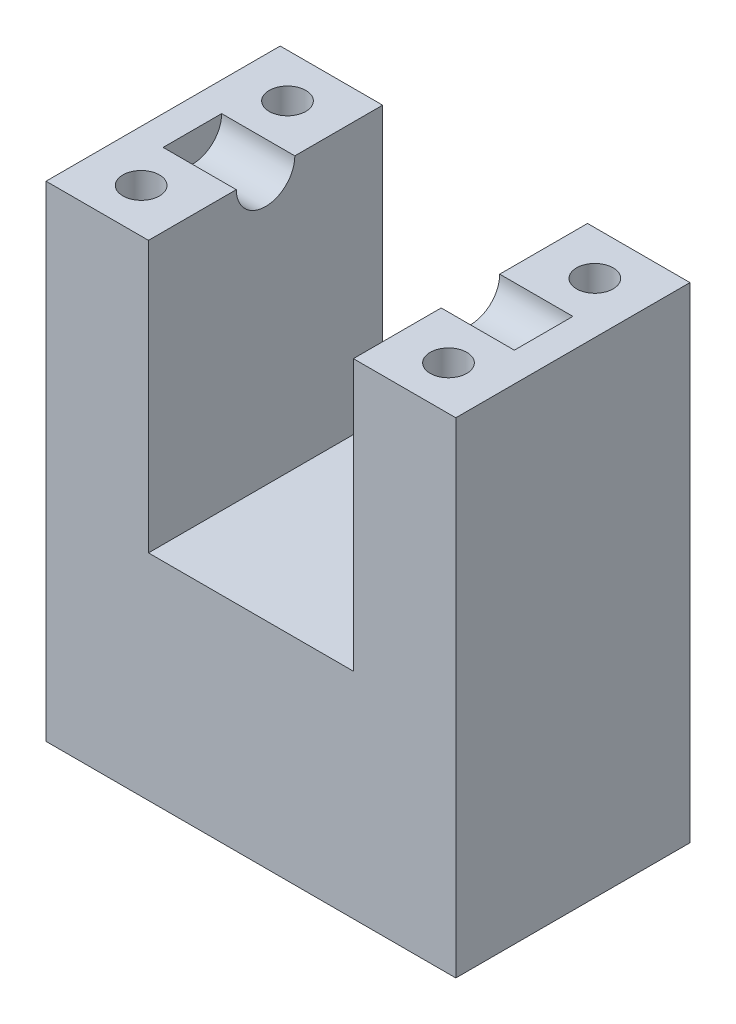
ISO-10303-21;
HEADER;
FILE_DESCRIPTION(('STEP AP214'),'2;1');
FILE_NAME('part.step','',(''),(''),'','','');
FILE_SCHEMA(('AUTOMOTIVE_DESIGN { 1 0 10303 214 1 1 1 1 }'));
ENDSEC;
DATA;
#1=APPLICATION_CONTEXT('core data for automotive mechanical design processes');
#2=APPLICATION_PROTOCOL_DEFINITION('international standard','automotive_design',2000,#1);
#3=PRODUCT_CONTEXT('',#1,'mechanical');
#4=PRODUCT('Part','Part','',(#3));
#5=PRODUCT_RELATED_PRODUCT_CATEGORY('part','',(#4));
#6=PRODUCT_DEFINITION_FORMATION('','',#4);
#7=PRODUCT_DEFINITION_CONTEXT('part definition',#1,'design');
#8=PRODUCT_DEFINITION('design','',#6,#7);
#9=PRODUCT_DEFINITION_SHAPE('','',#8);
#10=(LENGTH_UNIT() NAMED_UNIT(*) SI_UNIT(.MILLI.,.METRE.));
#11=(NAMED_UNIT(*) PLANE_ANGLE_UNIT() SI_UNIT($,.RADIAN.));
#12=(NAMED_UNIT(*) SI_UNIT($,.STERADIAN.) SOLID_ANGLE_UNIT());
#13=UNCERTAINTY_MEASURE_WITH_UNIT(LENGTH_MEASURE(1.E-05),#10,'distance_accuracy_value','');
#14=(GEOMETRIC_REPRESENTATION_CONTEXT(3) GLOBAL_UNCERTAINTY_ASSIGNED_CONTEXT((#13)) GLOBAL_UNIT_ASSIGNED_CONTEXT((#10,
#11,#12)) REPRESENTATION_CONTEXT('',''));
#15=CARTESIAN_POINT('',(0.,0.,0.));
#16=DIRECTION('',(0.,0.,1.));
#17=DIRECTION('',(1.,0.,0.));
#18=AXIS2_PLACEMENT_3D('',#15,#16,#17);
#19=CARTESIAN_POINT('',(0.,23.2664,0.));
#20=DIRECTION('',(0.,1.,0.));
#21=DIRECTION('',(0.,0.,1.));
#22=AXIS2_PLACEMENT_3D('',#19,#20,#21);
#23=PLANE('',#22);
#24=DIRECTION('',(1.,0.,0.));
#25=VECTOR('',#24,1.);
#26=CARTESIAN_POINT('',(0.,23.2664,0.));
#27=LINE('',#26,#25);
#28=CARTESIAN_POINT('',(11.1125,23.2664,0.));
#29=VERTEX_POINT('',#28);
#30=CARTESIAN_POINT('',(33.3375,23.2664,0.));
#31=VERTEX_POINT('',#30);
#32=EDGE_CURVE('E306',#29,#31,#27,.T.);
#33=ORIENTED_EDGE('',*,*,#32,.T.);
#34=DIRECTION('',(0.,0.,1.));
#35=VECTOR('',#34,1.);
#36=CARTESIAN_POINT('',(33.3375,23.2664,0.));
#37=LINE('',#36,#35);
#38=CARTESIAN_POINT('',(33.3375,23.2664,-25.4));
#39=VERTEX_POINT('',#38);
#40=EDGE_CURVE('E263',#39,#31,#37,.T.);
#41=ORIENTED_EDGE('',*,*,#40,.F.);
#42=DIRECTION('',(-1.,0.,0.));
#43=VECTOR('',#42,1.);
#44=CARTESIAN_POINT('',(0.,23.2664,-25.4));
#45=LINE('',#44,#43);
#46=CARTESIAN_POINT('',(11.1125,23.2664,-25.4));
#47=VERTEX_POINT('',#46);
#48=EDGE_CURVE('E318',#39,#47,#45,.T.);
#49=ORIENTED_EDGE('',*,*,#48,.T.);
#50=DIRECTION('',(0.,0.,-1.));
#51=VECTOR('',#50,1.);
#52=CARTESIAN_POINT('',(11.1125,23.2664,0.));
#53=LINE('',#52,#51);
#54=EDGE_CURVE('E284',#29,#47,#53,.T.);
#55=ORIENTED_EDGE('',*,*,#54,.F.);
#56=EDGE_LOOP('',(#33,#41,#49,#55));
#57=FACE_BOUND('',#56,.T.);
#58=ADVANCED_FACE('F35',(#57),#23,.T.);
#59=CARTESIAN_POINT('',(0.,12.7,-39.116));
#60=DIRECTION('',(1.,0.,0.));
#61=DIRECTION('',(0.,0.,-1.));
#62=AXIS2_PLACEMENT_3D('',#59,#60,#61);
#63=PLANE('',#62);
#64=DIRECTION('',(0.,0.,1.));
#65=VECTOR('',#64,1.);
#66=CARTESIAN_POINT('',(0.,0.,-39.116));
#67=LINE('',#66,#65);
#68=CARTESIAN_POINT('',(0.,0.,-39.116));
#69=VERTEX_POINT('',#68);
#70=CARTESIAN_POINT('',(0.,0.,0.));
#71=VERTEX_POINT('',#70);
#72=EDGE_CURVE('E383',#69,#71,#67,.T.);
#73=ORIENTED_EDGE('',*,*,#72,.T.);
#74=DIRECTION('',(0.,-1.,0.));
#75=VECTOR('',#74,1.);
#76=CARTESIAN_POINT('',(0.,12.7,0.));
#77=LINE('',#76,#75);
#78=CARTESIAN_POINT('',(0.,52.6288,0.));
#79=VERTEX_POINT('',#78);
#80=EDGE_CURVE('E336',#79,#71,#77,.T.);
#81=ORIENTED_EDGE('',*,*,#80,.F.);
#82=DIRECTION('',(0.,0.,1.));
#83=VECTOR('',#82,1.);
#84=CARTESIAN_POINT('',(0.,52.6288,0.));
#85=LINE('',#84,#83);
#86=CARTESIAN_POINT('',(0.,52.6288,-25.4));
#87=VERTEX_POINT('',#86);
#88=EDGE_CURVE('E285',#87,#79,#85,.T.);
#89=ORIENTED_EDGE('',*,*,#88,.F.);
#90=DIRECTION('',(0.,-1.,0.));
#91=VECTOR('',#90,1.);
#92=CARTESIAN_POINT('',(0.,97.7281367016958,-25.4));
#93=LINE('',#92,#91);
#94=CARTESIAN_POINT('',(0.,12.7,-25.4));
#95=VERTEX_POINT('',#94);
#96=EDGE_CURVE('E315',#87,#95,#93,.T.);
#97=ORIENTED_EDGE('',*,*,#96,.T.);
#98=DIRECTION('',(0.,0.,1.));
#99=VECTOR('',#98,1.);
#100=CARTESIAN_POINT('',(0.,12.7,-39.116));
#101=LINE('',#100,#99);
#102=CARTESIAN_POINT('',(0.,12.7,-39.116));
#103=VERTEX_POINT('',#102);
#104=EDGE_CURVE('E331',#103,#95,#101,.T.);
#105=ORIENTED_EDGE('',*,*,#104,.F.);
#106=DIRECTION('',(0.,-1.,0.));
#107=VECTOR('',#106,1.);
#108=CARTESIAN_POINT('',(0.,12.7,-39.116));
#109=LINE('',#108,#107);
#110=EDGE_CURVE('E356',#103,#69,#109,.T.);
#111=ORIENTED_EDGE('',*,*,#110,.T.);
#112=EDGE_LOOP('',(#73,#81,#89,#97,#105,#111));
#113=FACE_BOUND('',#112,.T.);
#114=ADVANCED_FACE('F37',(#113),#63,.F.);
#115=CARTESIAN_POINT('',(0.,12.7,0.));
#116=DIRECTION('',(0.,0.,-1.));
#117=DIRECTION('',(-1.,0.,0.));
#118=AXIS2_PLACEMENT_3D('',#115,#116,#117);
#119=PLANE('',#118);
#120=DIRECTION('',(1.,0.,0.));
#121=VECTOR('',#120,1.);
#122=CARTESIAN_POINT('',(0.,0.,0.));
#123=LINE('',#122,#121);
#124=CARTESIAN_POINT('',(44.45,0.,0.));
#125=VERTEX_POINT('',#124);
#126=EDGE_CURVE('E380',#71,#125,#123,.T.);
#127=ORIENTED_EDGE('',*,*,#126,.T.);
#128=DIRECTION('',(0.,-1.,0.));
#129=VECTOR('',#128,1.);
#130=CARTESIAN_POINT('',(44.45,12.7,0.));
#131=LINE('',#130,#129);
#132=CARTESIAN_POINT('',(44.45,52.6288,0.));
#133=VERTEX_POINT('',#132);
#134=EDGE_CURVE('E371',#133,#125,#131,.T.);
#135=ORIENTED_EDGE('',*,*,#134,.F.);
#136=DIRECTION('',(1.,0.,0.));
#137=VECTOR('',#136,1.);
#138=CARTESIAN_POINT('',(44.45,52.6288,0.));
#139=LINE('',#138,#137);
#140=CARTESIAN_POINT('',(33.3375,52.6288,0.));
#141=VERTEX_POINT('',#140);
#142=EDGE_CURVE('E273',#141,#133,#139,.T.);
#143=ORIENTED_EDGE('',*,*,#142,.F.);
#144=DIRECTION('',(0.,-1.,0.));
#145=VECTOR('',#144,1.);
#146=CARTESIAN_POINT('',(33.3375,52.6288,0.));
#147=LINE('',#146,#145);
#148=EDGE_CURVE('E276',#141,#31,#147,.T.);
#149=ORIENTED_EDGE('',*,*,#148,.T.);
#150=ORIENTED_EDGE('',*,*,#32,.F.);
#151=DIRECTION('',(0.,-1.,0.));
#152=VECTOR('',#151,1.);
#153=CARTESIAN_POINT('',(11.1125,52.6288,0.));
#154=LINE('',#153,#152);
#155=CARTESIAN_POINT('',(11.1125,52.6288,0.));
#156=VERTEX_POINT('',#155);
#157=EDGE_CURVE('E310',#156,#29,#154,.T.);
#158=ORIENTED_EDGE('',*,*,#157,.F.);
#159=DIRECTION('',(1.,0.,0.));
#160=VECTOR('',#159,1.);
#161=CARTESIAN_POINT('',(0.,52.6288,0.));
#162=LINE('',#161,#160);
#163=EDGE_CURVE('E288',#79,#156,#162,.T.);
#164=ORIENTED_EDGE('',*,*,#163,.F.);
#165=ORIENTED_EDGE('',*,*,#80,.T.);
#166=EDGE_LOOP('',(#127,#135,#143,#149,#150,#158,#164,#165));
#167=FACE_BOUND('',#166,.T.);
#168=ADVANCED_FACE('F379',(#167),#119,.F.);
#169=CARTESIAN_POINT('',(44.45,12.7,0.));
#170=DIRECTION('',(-1.,0.,0.));
#171=DIRECTION('',(0.,0.,1.));
#172=AXIS2_PLACEMENT_3D('',#169,#170,#171);
#173=PLANE('',#172);
#174=DIRECTION('',(0.,0.,-1.));
#175=VECTOR('',#174,1.);
#176=CARTESIAN_POINT('',(44.45,0.,0.));
#177=LINE('',#176,#175);
#178=CARTESIAN_POINT('',(44.45,0.,-25.4));
#179=VERTEX_POINT('',#178);
#180=EDGE_CURVE('E386',#125,#179,#177,.T.);
#181=ORIENTED_EDGE('',*,*,#180,.T.);
#182=DIRECTION('',(0.,-1.,0.));
#183=VECTOR('',#182,1.);
#184=CARTESIAN_POINT('',(44.45,12.7,-25.4));
#185=LINE('',#184,#183);
#186=CARTESIAN_POINT('',(44.45,52.6288,-25.4));
#187=VERTEX_POINT('',#186);
#188=EDGE_CURVE('E348',#187,#179,#185,.T.);
#189=ORIENTED_EDGE('',*,*,#188,.F.);
#190=DIRECTION('',(0.,0.,-1.));
#191=VECTOR('',#190,1.);
#192=CARTESIAN_POINT('',(44.45,52.6288,0.));
#193=LINE('',#192,#191);
#194=EDGE_CURVE('E264',#133,#187,#193,.T.);
#195=ORIENTED_EDGE('',*,*,#194,.F.);
#196=ORIENTED_EDGE('',*,*,#134,.T.);
#197=EDGE_LOOP('',(#181,#189,#195,#196));
#198=FACE_BOUND('',#197,.T.);
#199=ADVANCED_FACE('F411',(#198),#173,.F.);
#200=CARTESIAN_POINT('',(44.45,12.7,-25.4));
#201=DIRECTION('',(0.,0.,1.));
#202=DIRECTION('',(1.,0.,0.));
#203=AXIS2_PLACEMENT_3D('',#200,#201,#202);
#204=PLANE('',#203);
#205=DIRECTION('',(-1.,0.,0.));
#206=VECTOR('',#205,1.);
#207=CARTESIAN_POINT('',(44.45,0.,-25.4));
#208=LINE('',#207,#206);
#209=CARTESIAN_POINT('',(20.066,0.,-25.4));
#210=VERTEX_POINT('',#209);
#211=EDGE_CURVE('E390',#179,#210,#208,.T.);
#212=ORIENTED_EDGE('',*,*,#211,.T.);
#213=DIRECTION('',(0.,-1.,0.));
#214=VECTOR('',#213,1.);
#215=CARTESIAN_POINT('',(20.066,12.7,-25.4));
#216=LINE('',#215,#214);
#217=CARTESIAN_POINT('',(20.066,12.7,-25.4));
#218=VERTEX_POINT('',#217);
#219=EDGE_CURVE('E345',#218,#210,#216,.T.);
#220=ORIENTED_EDGE('',*,*,#219,.F.);
#221=DIRECTION('',(-1.,0.,0.));
#222=VECTOR('',#221,1.);
#223=CARTESIAN_POINT('',(0.,12.7,-25.4));
#224=LINE('',#223,#222);
#225=EDGE_CURVE('E338',#218,#95,#224,.T.);
#226=ORIENTED_EDGE('',*,*,#225,.T.);
#227=ORIENTED_EDGE('',*,*,#96,.F.);
#228=DIRECTION('',(-1.,0.,0.));
#229=VECTOR('',#228,1.);
#230=CARTESIAN_POINT('',(0.,52.6288,-25.4));
#231=LINE('',#230,#229);
#232=CARTESIAN_POINT('',(11.1125,52.6288,-25.4));
#233=VERTEX_POINT('',#232);
#234=EDGE_CURVE('E294',#233,#87,#231,.T.);
#235=ORIENTED_EDGE('',*,*,#234,.F.);
#236=DIRECTION('',(0.,-1.,0.));
#237=VECTOR('',#236,1.);
#238=CARTESIAN_POINT('',(11.1125,52.6288,-25.4));
#239=LINE('',#238,#237);
#240=EDGE_CURVE('E297',#233,#47,#239,.T.);
#241=ORIENTED_EDGE('',*,*,#240,.T.);
#242=ORIENTED_EDGE('',*,*,#48,.F.);
#243=DIRECTION('',(0.,-1.,0.));
#244=VECTOR('',#243,1.);
#245=CARTESIAN_POINT('',(33.3375,52.6288,-25.4));
#246=LINE('',#245,#244);
#247=CARTESIAN_POINT('',(33.3375,52.6288,-25.4));
#248=VERTEX_POINT('',#247);
#249=EDGE_CURVE('E281',#248,#39,#246,.T.);
#250=ORIENTED_EDGE('',*,*,#249,.F.);
#251=DIRECTION('',(-1.,0.,0.));
#252=VECTOR('',#251,1.);
#253=CARTESIAN_POINT('',(44.45,52.6288,-25.4));
#254=LINE('',#253,#252);
#255=EDGE_CURVE('E267',#187,#248,#254,.T.);
#256=ORIENTED_EDGE('',*,*,#255,.F.);
#257=ORIENTED_EDGE('',*,*,#188,.T.);
#258=EDGE_LOOP('',(#212,#220,#226,#227,#235,#241,#242,#250,#256,#257));
#259=FACE_BOUND('',#258,.T.);
#260=ADVANCED_FACE('F400',(#259),#204,.F.);
#261=CARTESIAN_POINT('',(20.066,12.7,-25.4));
#262=DIRECTION('',(-1.,0.,0.));
#263=DIRECTION('',(0.,0.,1.));
#264=AXIS2_PLACEMENT_3D('',#261,#262,#263);
#265=PLANE('',#264);
#266=DIRECTION('',(0.,0.,-1.));
#267=VECTOR('',#266,1.);
#268=CARTESIAN_POINT('',(20.066,0.,-25.4));
#269=LINE('',#268,#267);
#270=CARTESIAN_POINT('',(20.066,0.,-39.116));
#271=VERTEX_POINT('',#270);
#272=EDGE_CURVE('E391',#210,#271,#269,.T.);
#273=ORIENTED_EDGE('',*,*,#272,.T.);
#274=DIRECTION('',(0.,-1.,0.));
#275=VECTOR('',#274,1.);
#276=CARTESIAN_POINT('',(20.066,12.7,-39.116));
#277=LINE('',#276,#275);
#278=CARTESIAN_POINT('',(20.066,12.7,-39.116));
#279=VERTEX_POINT('',#278);
#280=EDGE_CURVE('E349',#279,#271,#277,.T.);
#281=ORIENTED_EDGE('',*,*,#280,.F.);
#282=DIRECTION('',(0.,0.,-1.));
#283=VECTOR('',#282,1.);
#284=CARTESIAN_POINT('',(20.066,12.7,-25.4));
#285=LINE('',#284,#283);
#286=EDGE_CURVE('E334',#218,#279,#285,.T.);
#287=ORIENTED_EDGE('',*,*,#286,.F.);
#288=ORIENTED_EDGE('',*,*,#219,.T.);
#289=EDGE_LOOP('',(#273,#281,#287,#288));
#290=FACE_BOUND('',#289,.T.);
#291=ADVANCED_FACE('F402',(#290),#265,.F.);
#292=CARTESIAN_POINT('',(20.066,12.7,-39.116));
#293=DIRECTION('',(0.,0.,1.));
#294=DIRECTION('',(1.,0.,0.));
#295=AXIS2_PLACEMENT_3D('',#292,#293,#294);
#296=PLANE('',#295);
#297=DIRECTION('',(-1.,0.,0.));
#298=VECTOR('',#297,1.);
#299=CARTESIAN_POINT('',(20.066,0.,-39.116));
#300=LINE('',#299,#298);
#301=EDGE_CURVE('E335',#271,#69,#300,.T.);
#302=ORIENTED_EDGE('',*,*,#301,.T.);
#303=ORIENTED_EDGE('',*,*,#110,.F.);
#304=DIRECTION('',(-1.,0.,0.));
#305=VECTOR('',#304,1.);
#306=CARTESIAN_POINT('',(20.066,12.7,-39.116));
#307=LINE('',#306,#305);
#308=EDGE_CURVE('E328',#279,#103,#307,.T.);
#309=ORIENTED_EDGE('',*,*,#308,.F.);
#310=ORIENTED_EDGE('',*,*,#280,.T.);
#311=EDGE_LOOP('',(#302,#303,#309,#310));
#312=FACE_BOUND('',#311,.T.);
#313=ADVANCED_FACE('F395',(#312),#296,.F.);
#314=CARTESIAN_POINT('',(0.,12.7,0.));
#315=DIRECTION('',(0.,1.,0.));
#316=DIRECTION('',(0.,0.,1.));
#317=AXIS2_PLACEMENT_3D('',#314,#315,#316);
#318=PLANE('',#317);
#319=ORIENTED_EDGE('',*,*,#225,.F.);
#320=ORIENTED_EDGE('',*,*,#286,.T.);
#321=ORIENTED_EDGE('',*,*,#308,.T.);
#322=ORIENTED_EDGE('',*,*,#104,.T.);
#323=EDGE_LOOP('',(#319,#320,#321,#322));
#324=FACE_BOUND('',#323,.T.);
#325=ADVANCED_FACE('F409',(#324),#318,.T.);
#326=CARTESIAN_POINT('',(0.,0.,0.));
#327=DIRECTION('',(0.,1.,0.));
#328=DIRECTION('',(0.,0.,1.));
#329=AXIS2_PLACEMENT_3D('',#326,#327,#328);
#330=PLANE('',#329);
#331=CARTESIAN_POINT('',(10.033,0.,-10.033));
#332=DIRECTION('',(0.,-1.,0.));
#333=DIRECTION('',(0.,0.,-1.));
#334=AXIS2_PLACEMENT_3D('',#331,#332,#333);
#335=CIRCLE('',#334,1.98437499999999);
#336=CARTESIAN_POINT('',(10.033,0.,-12.017375));
#337=VERTEX_POINT('',#336);
#338=EDGE_CURVE('E437',#337,#337,#335,.T.);
#339=ORIENTED_EDGE('',*,*,#338,.F.);
#340=EDGE_LOOP('',(#339));
#341=FACE_BOUND('',#340,.T.);
#342=CARTESIAN_POINT('',(29.083,0.,-10.033));
#343=DIRECTION('',(0.,-1.,0.));
#344=DIRECTION('',(0.,0.,-1.));
#345=AXIS2_PLACEMENT_3D('',#342,#343,#344);
#346=CIRCLE('',#345,1.98437499999999);
#347=CARTESIAN_POINT('',(29.083,0.,-12.017375));
#348=VERTEX_POINT('',#347);
#349=EDGE_CURVE('E171',#348,#348,#346,.T.);
#350=ORIENTED_EDGE('',*,*,#349,.F.);
#351=EDGE_LOOP('',(#350));
#352=FACE_BOUND('',#351,.T.);
#353=CARTESIAN_POINT('',(10.033,0.,-29.083));
#354=DIRECTION('',(0.,-1.,0.));
#355=DIRECTION('',(0.,0.,-1.));
#356=AXIS2_PLACEMENT_3D('',#353,#354,#355);
#357=CIRCLE('',#356,1.98437499999999);
#358=CARTESIAN_POINT('',(10.033,0.,-31.067375));
#359=VERTEX_POINT('',#358);
#360=EDGE_CURVE('E190',#359,#359,#357,.T.);
#361=ORIENTED_EDGE('',*,*,#360,.F.);
#362=EDGE_LOOP('',(#361));
#363=FACE_BOUND('',#362,.T.);
#364=ORIENTED_EDGE('',*,*,#72,.F.);
#365=ORIENTED_EDGE('',*,*,#301,.F.);
#366=ORIENTED_EDGE('',*,*,#272,.F.);
#367=ORIENTED_EDGE('',*,*,#211,.F.);
#368=ORIENTED_EDGE('',*,*,#180,.F.);
#369=ORIENTED_EDGE('',*,*,#126,.F.);
#370=EDGE_LOOP('',(#364,#365,#366,#367,#368,#369));
#371=FACE_BOUND('',#370,.T.);
#372=ADVANCED_FACE('F396',(#341,#352,#363,#371),#330,.F.);
#373=CARTESIAN_POINT('',(11.1125,52.6288,0.));
#374=DIRECTION('',(-1.,0.,0.));
#375=DIRECTION('',(0.,0.,1.));
#376=AXIS2_PLACEMENT_3D('',#373,#374,#375);
#377=PLANE('',#376);
#378=DIRECTION('',(0.,0.,-1.));
#379=VECTOR('',#378,1.);
#380=CARTESIAN_POINT('',(11.1125,52.6288,0.));
#381=LINE('',#380,#379);
#382=CARTESIAN_POINT('',(11.1125,52.6288,-15.875));
#383=VERTEX_POINT('',#382);
#384=EDGE_CURVE('E290',#383,#233,#381,.T.);
#385=ORIENTED_EDGE('',*,*,#384,.F.);
#386=CARTESIAN_POINT('',(11.1125,52.6288,-12.7));
#387=DIRECTION('',(-1.,0.,0.));
#388=DIRECTION('',(0.,0.,1.));
#389=AXIS2_PLACEMENT_3D('',#386,#387,#388);
#390=CIRCLE('',#389,3.175);
#391=CARTESIAN_POINT('',(11.1125,52.6288,-9.525));
#392=VERTEX_POINT('',#391);
#393=EDGE_CURVE('E50',#383,#392,#390,.T.);
#394=ORIENTED_EDGE('',*,*,#393,.T.);
#395=EDGE_CURVE('E291',#156,#392,#381,.T.);
#396=ORIENTED_EDGE('',*,*,#395,.F.);
#397=ORIENTED_EDGE('',*,*,#157,.T.);
#398=ORIENTED_EDGE('',*,*,#54,.T.);
#399=ORIENTED_EDGE('',*,*,#240,.F.);
#400=EDGE_LOOP('',(#385,#394,#396,#397,#398,#399));
#401=FACE_BOUND('',#400,.T.);
#402=ADVANCED_FACE('F421',(#401),#377,.F.);
#403=CARTESIAN_POINT('',(0.,52.6288,0.));
#404=DIRECTION('',(0.,-1.,0.));
#405=DIRECTION('',(0.,0.,-1.));
#406=AXIS2_PLACEMENT_3D('',#403,#404,#405);
#407=PLANE('',#406);
#408=CARTESIAN_POINT('',(5.55625,52.6288,-20.6375));
#409=DIRECTION('',(0.,1.,0.));
#410=DIRECTION('',(0.,0.,1.));
#411=AXIS2_PLACEMENT_3D('',#408,#409,#410);
#412=CIRCLE('',#411,1.984375);
#413=CARTESIAN_POINT('',(5.55625,52.6288,-18.653125));
#414=VERTEX_POINT('',#413);
#415=EDGE_CURVE('E202',#414,#414,#412,.T.);
#416=ORIENTED_EDGE('',*,*,#415,.F.);
#417=EDGE_LOOP('',(#416));
#418=FACE_BOUND('',#417,.T.);
#419=CARTESIAN_POINT('',(5.55625,52.6288,-4.7625));
#420=DIRECTION('',(0.,1.,0.));
#421=DIRECTION('',(0.,0.,1.));
#422=AXIS2_PLACEMENT_3D('',#419,#420,#421);
#423=CIRCLE('',#422,1.984375);
#424=CARTESIAN_POINT('',(5.55625,52.6288,-2.778125));
#425=VERTEX_POINT('',#424);
#426=EDGE_CURVE('E214',#425,#425,#423,.T.);
#427=ORIENTED_EDGE('',*,*,#426,.F.);
#428=EDGE_LOOP('',(#427));
#429=FACE_BOUND('',#428,.T.);
#430=ORIENTED_EDGE('',*,*,#395,.T.);
#431=DIRECTION('',(-1.,0.,0.));
#432=VECTOR('',#431,1.);
#433=CARTESIAN_POINT('',(0.,52.6288,-9.525));
#434=LINE('',#433,#432);
#435=CARTESIAN_POINT('',(3.175,52.6288,-9.525));
#436=VERTEX_POINT('',#435);
#437=EDGE_CURVE('E260',#392,#436,#434,.T.);
#438=ORIENTED_EDGE('',*,*,#437,.T.);
#439=DIRECTION('',(0.,0.,-1.));
#440=VECTOR('',#439,1.);
#441=CARTESIAN_POINT('',(3.175,52.6288,0.));
#442=LINE('',#441,#440);
#443=CARTESIAN_POINT('',(3.175,52.6288,-15.875));
#444=VERTEX_POINT('',#443);
#445=EDGE_CURVE('E12',#436,#444,#442,.T.);
#446=ORIENTED_EDGE('',*,*,#445,.T.);
#447=DIRECTION('',(-1.,0.,0.));
#448=VECTOR('',#447,1.);
#449=CARTESIAN_POINT('',(0.,52.6288,-15.875));
#450=LINE('',#449,#448);
#451=EDGE_CURVE('E257',#444,#383,#450,.F.);
#452=ORIENTED_EDGE('',*,*,#451,.T.);
#453=ORIENTED_EDGE('',*,*,#384,.T.);
#454=ORIENTED_EDGE('',*,*,#234,.T.);
#455=ORIENTED_EDGE('',*,*,#88,.T.);
#456=ORIENTED_EDGE('',*,*,#163,.T.);
#457=EDGE_LOOP('',(#430,#438,#446,#452,#453,#454,#455,#456));
#458=FACE_BOUND('',#457,.T.);
#459=ADVANCED_FACE('F432',(#418,#429,#458),#407,.F.);
#460=CARTESIAN_POINT('',(33.3375,52.6288,0.));
#461=DIRECTION('',(1.,0.,0.));
#462=DIRECTION('',(0.,0.,-1.));
#463=AXIS2_PLACEMENT_3D('',#460,#461,#462);
#464=PLANE('',#463);
#465=DIRECTION('',(0.,0.,1.));
#466=VECTOR('',#465,1.);
#467=CARTESIAN_POINT('',(33.3375,52.6288,0.));
#468=LINE('',#467,#466);
#469=CARTESIAN_POINT('',(33.3375,52.6288,-9.525));
#470=VERTEX_POINT('',#469);
#471=EDGE_CURVE('E269',#470,#141,#468,.T.);
#472=ORIENTED_EDGE('',*,*,#471,.F.);
#473=CARTESIAN_POINT('',(33.3375,52.6288,-12.7));
#474=DIRECTION('',(1.,0.,0.));
#475=DIRECTION('',(0.,0.,-1.));
#476=AXIS2_PLACEMENT_3D('',#473,#474,#475);
#477=CIRCLE('',#476,3.175);
#478=CARTESIAN_POINT('',(33.3375,52.6288,-15.875));
#479=VERTEX_POINT('',#478);
#480=EDGE_CURVE('E254',#470,#479,#477,.T.);
#481=ORIENTED_EDGE('',*,*,#480,.T.);
#482=EDGE_CURVE('E270',#248,#479,#468,.T.);
#483=ORIENTED_EDGE('',*,*,#482,.F.);
#484=ORIENTED_EDGE('',*,*,#249,.T.);
#485=ORIENTED_EDGE('',*,*,#40,.T.);
#486=ORIENTED_EDGE('',*,*,#148,.F.);
#487=EDGE_LOOP('',(#472,#481,#483,#484,#485,#486));
#488=FACE_BOUND('',#487,.T.);
#489=ADVANCED_FACE('F547',(#488),#464,.F.);
#490=CARTESIAN_POINT('',(0.,52.6288,0.));
#491=DIRECTION('',(0.,1.,0.));
#492=DIRECTION('',(0.,0.,1.));
#493=AXIS2_PLACEMENT_3D('',#490,#491,#492);
#494=PLANE('',#493);
#495=CARTESIAN_POINT('',(38.89375,52.6288,-20.6375));
#496=DIRECTION('',(0.,1.,0.));
#497=DIRECTION('',(0.,0.,1.));
#498=AXIS2_PLACEMENT_3D('',#495,#496,#497);
#499=CIRCLE('',#498,1.984375);
#500=CARTESIAN_POINT('',(38.89375,52.6288,-18.653125));
#501=VERTEX_POINT('',#500);
#502=EDGE_CURVE('E226',#501,#501,#499,.T.);
#503=ORIENTED_EDGE('',*,*,#502,.F.);
#504=EDGE_LOOP('',(#503));
#505=FACE_BOUND('',#504,.T.);
#506=CARTESIAN_POINT('',(38.89375,52.6288,-4.7625));
#507=DIRECTION('',(0.,1.,0.));
#508=DIRECTION('',(0.,0.,1.));
#509=AXIS2_PLACEMENT_3D('',#506,#507,#508);
#510=CIRCLE('',#509,1.984375);
#511=CARTESIAN_POINT('',(38.89375,52.6288,-2.778125));
#512=VERTEX_POINT('',#511);
#513=EDGE_CURVE('E238',#512,#512,#510,.T.);
#514=ORIENTED_EDGE('',*,*,#513,.F.);
#515=EDGE_LOOP('',(#514));
#516=FACE_BOUND('',#515,.T.);
#517=DIRECTION('',(-1.,0.,0.));
#518=VECTOR('',#517,1.);
#519=CARTESIAN_POINT('',(0.,52.6288,-15.875));
#520=LINE('',#519,#518);
#521=CARTESIAN_POINT('',(41.275,52.6288,-15.875));
#522=VERTEX_POINT('',#521);
#523=EDGE_CURVE('E43',#522,#479,#520,.T.);
#524=ORIENTED_EDGE('',*,*,#523,.F.);
#525=DIRECTION('',(0.,0.,-1.));
#526=VECTOR('',#525,1.);
#527=CARTESIAN_POINT('',(41.275,52.6288,0.));
#528=LINE('',#527,#526);
#529=CARTESIAN_POINT('',(41.275,52.6288,-9.525));
#530=VERTEX_POINT('',#529);
#531=EDGE_CURVE('E321',#530,#522,#528,.T.);
#532=ORIENTED_EDGE('',*,*,#531,.F.);
#533=DIRECTION('',(-1.,0.,0.));
#534=VECTOR('',#533,1.);
#535=CARTESIAN_POINT('',(0.,52.6288,-9.525));
#536=LINE('',#535,#534);
#537=EDGE_CURVE('E897',#470,#530,#536,.F.);
#538=ORIENTED_EDGE('',*,*,#537,.F.);
#539=ORIENTED_EDGE('',*,*,#471,.T.);
#540=ORIENTED_EDGE('',*,*,#142,.T.);
#541=ORIENTED_EDGE('',*,*,#194,.T.);
#542=ORIENTED_EDGE('',*,*,#255,.T.);
#543=ORIENTED_EDGE('',*,*,#482,.T.);
#544=EDGE_LOOP('',(#524,#532,#538,#539,#540,#541,#542,#543));
#545=FACE_BOUND('',#544,.T.);
#546=ADVANCED_FACE('F537',(#505,#516,#545),#494,.T.);
#547=CARTESIAN_POINT('',(41.275,52.6288,-12.7));
#548=DIRECTION('',(1.,0.,0.));
#549=DIRECTION('',(0.,0.,-1.));
#550=AXIS2_PLACEMENT_3D('',#547,#548,#549);
#551=PLANE('',#550);
#552=ORIENTED_EDGE('',*,*,#531,.T.);
#553=CARTESIAN_POINT('',(41.275,52.6288,-12.7));
#554=DIRECTION('',(-1.,0.,0.));
#555=DIRECTION('',(0.,0.,1.));
#556=AXIS2_PLACEMENT_3D('',#553,#554,#555);
#557=CIRCLE('',#556,3.175);
#558=EDGE_CURVE('E57',#522,#530,#557,.T.);
#559=ORIENTED_EDGE('',*,*,#558,.T.);
#560=EDGE_LOOP('',(#552,#559));
#561=FACE_BOUND('',#560,.T.);
#562=ADVANCED_FACE('F533',(#561),#551,.F.);
#563=CARTESIAN_POINT('',(0.,52.6288,-12.7));
#564=DIRECTION('',(-1.,0.,0.));
#565=DIRECTION('',(0.,0.,1.));
#566=AXIS2_PLACEMENT_3D('',#563,#564,#565);
#567=CYLINDRICAL_SURFACE('',#566,3.175);
#568=ORIENTED_EDGE('',*,*,#523,.T.);
#569=ORIENTED_EDGE('',*,*,#480,.F.);
#570=ORIENTED_EDGE('',*,*,#537,.T.);
#571=ORIENTED_EDGE('',*,*,#558,.F.);
#572=EDGE_LOOP('',(#568,#569,#570,#571));
#573=FACE_BOUND('',#572,.T.);
#574=ADVANCED_FACE('F536',(#573),#567,.F.);
#575=CARTESIAN_POINT('',(3.175,52.6288,-12.7));
#576=DIRECTION('',(-1.,0.,0.));
#577=DIRECTION('',(0.,0.,1.));
#578=AXIS2_PLACEMENT_3D('',#575,#576,#577);
#579=PLANE('',#578);
#580=CARTESIAN_POINT('',(3.175,52.6288,-12.7));
#581=DIRECTION('',(-1.,0.,0.));
#582=DIRECTION('',(0.,0.,1.));
#583=AXIS2_PLACEMENT_3D('',#580,#581,#582);
#584=CIRCLE('',#583,3.175);
#585=EDGE_CURVE('E251',#444,#436,#584,.T.);
#586=ORIENTED_EDGE('',*,*,#585,.F.);
#587=ORIENTED_EDGE('',*,*,#445,.F.);
#588=EDGE_LOOP('',(#586,#587));
#589=FACE_BOUND('',#588,.T.);
#590=ADVANCED_FACE('F540',(#589),#579,.F.);
#591=ORIENTED_EDGE('',*,*,#393,.F.);
#592=ORIENTED_EDGE('',*,*,#451,.F.);
#593=ORIENTED_EDGE('',*,*,#585,.T.);
#594=ORIENTED_EDGE('',*,*,#437,.F.);
#595=EDGE_LOOP('',(#591,#592,#593,#594));
#596=FACE_BOUND('',#595,.T.);
#597=ADVANCED_FACE('F531',(#596),#567,.F.);
#598=CARTESIAN_POINT('',(38.89375,33.5788,-4.7625));
#599=DIRECTION('',(0.,1.,0.));
#600=DIRECTION('',(0.,0.,1.));
#601=AXIS2_PLACEMENT_3D('',#598,#599,#600);
#602=CONICAL_SURFACE('',#601,1.63194999999999,1.02974425867665);
#603=CARTESIAN_POINT('',(38.89375,32.598225512778,-4.7625));
#604=VERTEX_POINT('',#603);
#605=VERTEX_LOOP('',#604);
#606=FACE_BOUND('',#605,.T.);
#607=CARTESIAN_POINT('',(38.89375,33.5788,-4.7625));
#608=DIRECTION('',(0.,1.,0.));
#609=DIRECTION('',(0.,0.,1.));
#610=AXIS2_PLACEMENT_3D('',#607,#608,#609);
#611=CIRCLE('',#610,1.63194999999999);
#612=CARTESIAN_POINT('',(38.89375,33.5788,-3.13055000000001));
#613=VERTEX_POINT('',#612);
#614=EDGE_CURVE('E247',#613,#613,#611,.T.);
#615=ORIENTED_EDGE('',*,*,#614,.T.);
#616=EDGE_LOOP('',(#615));
#617=FACE_BOUND('',#616,.T.);
#618=ADVANCED_FACE('F527',(#606,#617),#602,.F.);
#619=CARTESIAN_POINT('',(38.89375,52.6288,-4.7625));
#620=DIRECTION('',(0.,1.,0.));
#621=DIRECTION('',(0.,0.,1.));
#622=AXIS2_PLACEMENT_3D('',#619,#620,#621);
#623=CYLINDRICAL_SURFACE('',#622,1.63195);
#624=ORIENTED_EDGE('',*,*,#614,.F.);
#625=EDGE_LOOP('',(#624));
#626=FACE_BOUND('',#625,.T.);
#627=CARTESIAN_POINT('',(38.89375,47.8663,-4.7625));
#628=DIRECTION('',(0.,1.,0.));
#629=DIRECTION('',(0.,0.,1.));
#630=AXIS2_PLACEMENT_3D('',#627,#628,#629);
#631=CIRCLE('',#630,1.63195);
#632=CARTESIAN_POINT('',(38.89375,47.8663,-3.13055));
#633=VERTEX_POINT('',#632);
#634=EDGE_CURVE('E244',#633,#633,#631,.T.);
#635=ORIENTED_EDGE('',*,*,#634,.T.);
#636=EDGE_LOOP('',(#635));
#637=FACE_BOUND('',#636,.T.);
#638=ADVANCED_FACE('F523',(#626,#637),#623,.F.);
#639=CARTESIAN_POINT('',(40.5257,47.8663,-4.7625));
#640=DIRECTION('',(0.,-1.,0.));
#641=DIRECTION('',(0.,0.,-1.));
#642=AXIS2_PLACEMENT_3D('',#639,#640,#641);
#643=PLANE('',#642);
#644=ORIENTED_EDGE('',*,*,#634,.F.);
#645=EDGE_LOOP('',(#644));
#646=FACE_BOUND('',#645,.T.);
#647=CARTESIAN_POINT('',(38.89375,47.8663,-4.7625));
#648=DIRECTION('',(0.,1.,0.));
#649=DIRECTION('',(0.,0.,1.));
#650=AXIS2_PLACEMENT_3D('',#647,#648,#649);
#651=CIRCLE('',#650,1.984375);
#652=CARTESIAN_POINT('',(38.89375,47.8663,-2.778125));
#653=VERTEX_POINT('',#652);
#654=EDGE_CURVE('E241',#653,#653,#651,.T.);
#655=ORIENTED_EDGE('',*,*,#654,.T.);
#656=EDGE_LOOP('',(#655));
#657=FACE_BOUND('',#656,.T.);
#658=ADVANCED_FACE('F519',(#646,#657),#643,.F.);
#659=CARTESIAN_POINT('',(38.89375,52.6288,-4.7625));
#660=DIRECTION('',(0.,1.,0.));
#661=DIRECTION('',(0.,0.,1.));
#662=AXIS2_PLACEMENT_3D('',#659,#660,#661);
#663=CYLINDRICAL_SURFACE('',#662,1.984375);
#664=ORIENTED_EDGE('',*,*,#654,.F.);
#665=EDGE_LOOP('',(#664));
#666=FACE_BOUND('',#665,.T.);
#667=ORIENTED_EDGE('',*,*,#513,.T.);
#668=EDGE_LOOP('',(#667));
#669=FACE_BOUND('',#668,.T.);
#670=ADVANCED_FACE('F515',(#666,#669),#663,.F.);
#671=CARTESIAN_POINT('',(38.89375,33.5788,-20.6375));
#672=DIRECTION('',(0.,1.,0.));
#673=DIRECTION('',(0.,0.,1.));
#674=AXIS2_PLACEMENT_3D('',#671,#672,#673);
#675=CONICAL_SURFACE('',#674,1.63194999999999,1.02974425867665);
#676=CARTESIAN_POINT('',(38.89375,32.598225512778,-20.6375));
#677=VERTEX_POINT('',#676);
#678=VERTEX_LOOP('',#677);
#679=FACE_BOUND('',#678,.T.);
#680=CARTESIAN_POINT('',(38.89375,33.5788,-20.6375));
#681=DIRECTION('',(0.,1.,0.));
#682=DIRECTION('',(0.,0.,1.));
#683=AXIS2_PLACEMENT_3D('',#680,#681,#682);
#684=CIRCLE('',#683,1.63194999999999);
#685=CARTESIAN_POINT('',(38.89375,33.5788,-19.00555));
#686=VERTEX_POINT('',#685);
#687=EDGE_CURVE('E235',#686,#686,#684,.T.);
#688=ORIENTED_EDGE('',*,*,#687,.T.);
#689=EDGE_LOOP('',(#688));
#690=FACE_BOUND('',#689,.T.);
#691=ADVANCED_FACE('F511',(#679,#690),#675,.F.);
#692=CARTESIAN_POINT('',(38.89375,52.6288,-20.6375));
#693=DIRECTION('',(0.,1.,0.));
#694=DIRECTION('',(0.,0.,1.));
#695=AXIS2_PLACEMENT_3D('',#692,#693,#694);
#696=CYLINDRICAL_SURFACE('',#695,1.63195);
#697=ORIENTED_EDGE('',*,*,#687,.F.);
#698=EDGE_LOOP('',(#697));
#699=FACE_BOUND('',#698,.T.);
#700=CARTESIAN_POINT('',(38.89375,47.8663,-20.6375));
#701=DIRECTION('',(0.,1.,0.));
#702=DIRECTION('',(0.,0.,1.));
#703=AXIS2_PLACEMENT_3D('',#700,#701,#702);
#704=CIRCLE('',#703,1.63195);
#705=CARTESIAN_POINT('',(38.89375,47.8663,-19.00555));
#706=VERTEX_POINT('',#705);
#707=EDGE_CURVE('E232',#706,#706,#704,.T.);
#708=ORIENTED_EDGE('',*,*,#707,.T.);
#709=EDGE_LOOP('',(#708));
#710=FACE_BOUND('',#709,.T.);
#711=ADVANCED_FACE('F507',(#699,#710),#696,.F.);
#712=CARTESIAN_POINT('',(40.5257,47.8663,-20.6375));
#713=DIRECTION('',(0.,-1.,0.));
#714=DIRECTION('',(0.,0.,-1.));
#715=AXIS2_PLACEMENT_3D('',#712,#713,#714);
#716=PLANE('',#715);
#717=ORIENTED_EDGE('',*,*,#707,.F.);
#718=EDGE_LOOP('',(#717));
#719=FACE_BOUND('',#718,.T.);
#720=CARTESIAN_POINT('',(38.89375,47.8663,-20.6375));
#721=DIRECTION('',(0.,1.,0.));
#722=DIRECTION('',(0.,0.,1.));
#723=AXIS2_PLACEMENT_3D('',#720,#721,#722);
#724=CIRCLE('',#723,1.984375);
#725=CARTESIAN_POINT('',(38.89375,47.8663,-18.653125));
#726=VERTEX_POINT('',#725);
#727=EDGE_CURVE('E229',#726,#726,#724,.T.);
#728=ORIENTED_EDGE('',*,*,#727,.T.);
#729=EDGE_LOOP('',(#728));
#730=FACE_BOUND('',#729,.T.);
#731=ADVANCED_FACE('F503',(#719,#730),#716,.F.);
#732=CARTESIAN_POINT('',(38.89375,52.6288,-20.6375));
#733=DIRECTION('',(0.,1.,0.));
#734=DIRECTION('',(0.,0.,1.));
#735=AXIS2_PLACEMENT_3D('',#732,#733,#734);
#736=CYLINDRICAL_SURFACE('',#735,1.984375);
#737=ORIENTED_EDGE('',*,*,#727,.F.);
#738=EDGE_LOOP('',(#737));
#739=FACE_BOUND('',#738,.T.);
#740=ORIENTED_EDGE('',*,*,#502,.T.);
#741=EDGE_LOOP('',(#740));
#742=FACE_BOUND('',#741,.T.);
#743=ADVANCED_FACE('F499',(#739,#742),#736,.F.);
#744=CARTESIAN_POINT('',(5.55625,33.5788,-4.7625));
#745=DIRECTION('',(0.,1.,0.));
#746=DIRECTION('',(0.,0.,1.));
#747=AXIS2_PLACEMENT_3D('',#744,#745,#746);
#748=CONICAL_SURFACE('',#747,1.63195,1.02974425867665);
#749=CARTESIAN_POINT('',(5.55624999999999,32.598225512778,-4.7625));
#750=VERTEX_POINT('',#749);
#751=VERTEX_LOOP('',#750);
#752=FACE_BOUND('',#751,.T.);
#753=CARTESIAN_POINT('',(5.55625,33.5788,-4.7625));
#754=DIRECTION('',(0.,1.,0.));
#755=DIRECTION('',(0.,0.,1.));
#756=AXIS2_PLACEMENT_3D('',#753,#754,#755);
#757=CIRCLE('',#756,1.63195);
#758=CARTESIAN_POINT('',(5.55625,33.5788,-3.13055));
#759=VERTEX_POINT('',#758);
#760=EDGE_CURVE('E223',#759,#759,#757,.T.);
#761=ORIENTED_EDGE('',*,*,#760,.T.);
#762=EDGE_LOOP('',(#761));
#763=FACE_BOUND('',#762,.T.);
#764=ADVANCED_FACE('F495',(#752,#763),#748,.F.);
#765=CARTESIAN_POINT('',(5.55625,52.6288,-4.7625));
#766=DIRECTION('',(0.,1.,0.));
#767=DIRECTION('',(0.,0.,1.));
#768=AXIS2_PLACEMENT_3D('',#765,#766,#767);
#769=CYLINDRICAL_SURFACE('',#768,1.63195);
#770=ORIENTED_EDGE('',*,*,#760,.F.);
#771=EDGE_LOOP('',(#770));
#772=FACE_BOUND('',#771,.T.);
#773=CARTESIAN_POINT('',(5.55625,47.8663,-4.7625));
#774=DIRECTION('',(0.,1.,0.));
#775=DIRECTION('',(0.,0.,1.));
#776=AXIS2_PLACEMENT_3D('',#773,#774,#775);
#777=CIRCLE('',#776,1.63195);
#778=CARTESIAN_POINT('',(5.55625,47.8663,-3.13055));
#779=VERTEX_POINT('',#778);
#780=EDGE_CURVE('E220',#779,#779,#777,.T.);
#781=ORIENTED_EDGE('',*,*,#780,.T.);
#782=EDGE_LOOP('',(#781));
#783=FACE_BOUND('',#782,.T.);
#784=ADVANCED_FACE('F491',(#772,#783),#769,.F.);
#785=CARTESIAN_POINT('',(7.1882,47.8663,-4.7625));
#786=DIRECTION('',(0.,-1.,0.));
#787=DIRECTION('',(0.,0.,-1.));
#788=AXIS2_PLACEMENT_3D('',#785,#786,#787);
#789=PLANE('',#788);
#790=ORIENTED_EDGE('',*,*,#780,.F.);
#791=EDGE_LOOP('',(#790));
#792=FACE_BOUND('',#791,.T.);
#793=CARTESIAN_POINT('',(5.55625,47.8663,-4.7625));
#794=DIRECTION('',(0.,1.,0.));
#795=DIRECTION('',(0.,0.,1.));
#796=AXIS2_PLACEMENT_3D('',#793,#794,#795);
#797=CIRCLE('',#796,1.984375);
#798=CARTESIAN_POINT('',(5.55625,47.8663,-2.778125));
#799=VERTEX_POINT('',#798);
#800=EDGE_CURVE('E217',#799,#799,#797,.T.);
#801=ORIENTED_EDGE('',*,*,#800,.T.);
#802=EDGE_LOOP('',(#801));
#803=FACE_BOUND('',#802,.T.);
#804=ADVANCED_FACE('F487',(#792,#803),#789,.F.);
#805=CARTESIAN_POINT('',(5.55625,52.6288,-4.7625));
#806=DIRECTION('',(0.,1.,0.));
#807=DIRECTION('',(0.,0.,1.));
#808=AXIS2_PLACEMENT_3D('',#805,#806,#807);
#809=CYLINDRICAL_SURFACE('',#808,1.984375);
#810=ORIENTED_EDGE('',*,*,#800,.F.);
#811=EDGE_LOOP('',(#810));
#812=FACE_BOUND('',#811,.T.);
#813=ORIENTED_EDGE('',*,*,#426,.T.);
#814=EDGE_LOOP('',(#813));
#815=FACE_BOUND('',#814,.T.);
#816=ADVANCED_FACE('F483',(#812,#815),#809,.F.);
#817=CARTESIAN_POINT('',(5.55625,33.5788,-20.6375));
#818=DIRECTION('',(0.,1.,0.));
#819=DIRECTION('',(0.,0.,1.));
#820=AXIS2_PLACEMENT_3D('',#817,#818,#819);
#821=CONICAL_SURFACE('',#820,1.63195,1.02974425867665);
#822=CARTESIAN_POINT('',(5.55624999999999,32.598225512778,-20.6375));
#823=VERTEX_POINT('',#822);
#824=VERTEX_LOOP('',#823);
#825=FACE_BOUND('',#824,.T.);
#826=CARTESIAN_POINT('',(5.55625,33.5788,-20.6375));
#827=DIRECTION('',(0.,1.,0.));
#828=DIRECTION('',(0.,0.,1.));
#829=AXIS2_PLACEMENT_3D('',#826,#827,#828);
#830=CIRCLE('',#829,1.63195);
#831=CARTESIAN_POINT('',(5.55625,33.5788,-19.00555));
#832=VERTEX_POINT('',#831);
#833=EDGE_CURVE('E211',#832,#832,#830,.T.);
#834=ORIENTED_EDGE('',*,*,#833,.T.);
#835=EDGE_LOOP('',(#834));
#836=FACE_BOUND('',#835,.T.);
#837=ADVANCED_FACE('F479',(#825,#836),#821,.F.);
#838=CARTESIAN_POINT('',(5.55625,52.6288,-20.6375));
#839=DIRECTION('',(0.,1.,0.));
#840=DIRECTION('',(0.,0.,1.));
#841=AXIS2_PLACEMENT_3D('',#838,#839,#840);
#842=CYLINDRICAL_SURFACE('',#841,1.63195);
#843=ORIENTED_EDGE('',*,*,#833,.F.);
#844=EDGE_LOOP('',(#843));
#845=FACE_BOUND('',#844,.T.);
#846=CARTESIAN_POINT('',(5.55625,47.8663,-20.6375));
#847=DIRECTION('',(0.,1.,0.));
#848=DIRECTION('',(0.,0.,1.));
#849=AXIS2_PLACEMENT_3D('',#846,#847,#848);
#850=CIRCLE('',#849,1.63195);
#851=CARTESIAN_POINT('',(5.55625,47.8663,-19.00555));
#852=VERTEX_POINT('',#851);
#853=EDGE_CURVE('E208',#852,#852,#850,.T.);
#854=ORIENTED_EDGE('',*,*,#853,.T.);
#855=EDGE_LOOP('',(#854));
#856=FACE_BOUND('',#855,.T.);
#857=ADVANCED_FACE('F475',(#845,#856),#842,.F.);
#858=CARTESIAN_POINT('',(7.1882,47.8663,-20.6375));
#859=DIRECTION('',(0.,-1.,0.));
#860=DIRECTION('',(0.,0.,-1.));
#861=AXIS2_PLACEMENT_3D('',#858,#859,#860);
#862=PLANE('',#861);
#863=ORIENTED_EDGE('',*,*,#853,.F.);
#864=EDGE_LOOP('',(#863));
#865=FACE_BOUND('',#864,.T.);
#866=CARTESIAN_POINT('',(5.55625,47.8663,-20.6375));
#867=DIRECTION('',(0.,1.,0.));
#868=DIRECTION('',(0.,0.,1.));
#869=AXIS2_PLACEMENT_3D('',#866,#867,#868);
#870=CIRCLE('',#869,1.984375);
#871=CARTESIAN_POINT('',(5.55625,47.8663,-18.653125));
#872=VERTEX_POINT('',#871);
#873=EDGE_CURVE('E205',#872,#872,#870,.T.);
#874=ORIENTED_EDGE('',*,*,#873,.T.);
#875=EDGE_LOOP('',(#874));
#876=FACE_BOUND('',#875,.T.);
#877=ADVANCED_FACE('F471',(#865,#876),#862,.F.);
#878=CARTESIAN_POINT('',(5.55625,52.6288,-20.6375));
#879=DIRECTION('',(0.,1.,0.));
#880=DIRECTION('',(0.,0.,1.));
#881=AXIS2_PLACEMENT_3D('',#878,#879,#880);
#882=CYLINDRICAL_SURFACE('',#881,1.984375);
#883=ORIENTED_EDGE('',*,*,#873,.F.);
#884=EDGE_LOOP('',(#883));
#885=FACE_BOUND('',#884,.T.);
#886=ORIENTED_EDGE('',*,*,#415,.T.);
#887=EDGE_LOOP('',(#886));
#888=FACE_BOUND('',#887,.T.);
#889=ADVANCED_FACE('F467',(#885,#888),#882,.F.);
#890=CARTESIAN_POINT('',(10.033,9.525,-29.083));
#891=DIRECTION('',(0.,-1.,0.));
#892=DIRECTION('',(0.,0.,-1.));
#893=AXIS2_PLACEMENT_3D('',#890,#891,#892);
#894=CONICAL_SURFACE('',#893,1.63195,1.02974425867665);
#895=CARTESIAN_POINT('',(10.033,10.505574487222,-29.083));
#896=VERTEX_POINT('',#895);
#897=VERTEX_LOOP('',#896);
#898=FACE_BOUND('',#897,.T.);
#899=CARTESIAN_POINT('',(10.033,9.525,-29.083));
#900=DIRECTION('',(0.,-1.,0.));
#901=DIRECTION('',(0.,0.,-1.));
#902=AXIS2_PLACEMENT_3D('',#899,#900,#901);
#903=CIRCLE('',#902,1.63195);
#904=CARTESIAN_POINT('',(10.033,9.525,-30.71495));
#905=VERTEX_POINT('',#904);
#906=EDGE_CURVE('E199',#905,#905,#903,.T.);
#907=ORIENTED_EDGE('',*,*,#906,.T.);
#908=EDGE_LOOP('',(#907));
#909=FACE_BOUND('',#908,.T.);
#910=ADVANCED_FACE('F463',(#898,#909),#894,.F.);
#911=CARTESIAN_POINT('',(10.033,0.,-29.083));
#912=DIRECTION('',(0.,-1.,0.));
#913=DIRECTION('',(0.,0.,-1.));
#914=AXIS2_PLACEMENT_3D('',#911,#912,#913);
#915=CYLINDRICAL_SURFACE('',#914,1.63195);
#916=ORIENTED_EDGE('',*,*,#906,.F.);
#917=EDGE_LOOP('',(#916));
#918=FACE_BOUND('',#917,.T.);
#919=CARTESIAN_POINT('',(10.033,4.7625,-29.083));
#920=DIRECTION('',(0.,-1.,0.));
#921=DIRECTION('',(0.,0.,-1.));
#922=AXIS2_PLACEMENT_3D('',#919,#920,#921);
#923=CIRCLE('',#922,1.63194999999999);
#924=CARTESIAN_POINT('',(10.033,4.7625,-30.71495));
#925=VERTEX_POINT('',#924);
#926=EDGE_CURVE('E196',#925,#925,#923,.T.);
#927=ORIENTED_EDGE('',*,*,#926,.T.);
#928=EDGE_LOOP('',(#927));
#929=FACE_BOUND('',#928,.T.);
#930=ADVANCED_FACE('F455',(#918,#929),#915,.F.);
#931=CARTESIAN_POINT('',(11.66495,4.7625,-29.083));
#932=DIRECTION('',(0.,1.,0.));
#933=DIRECTION('',(0.,0.,1.));
#934=AXIS2_PLACEMENT_3D('',#931,#932,#933);
#935=PLANE('',#934);
#936=ORIENTED_EDGE('',*,*,#926,.F.);
#937=EDGE_LOOP('',(#936));
#938=FACE_BOUND('',#937,.T.);
#939=CARTESIAN_POINT('',(10.033,4.7625,-29.083));
#940=DIRECTION('',(0.,-1.,0.));
#941=DIRECTION('',(0.,0.,-1.));
#942=AXIS2_PLACEMENT_3D('',#939,#940,#941);
#943=CIRCLE('',#942,1.98437499999999);
#944=CARTESIAN_POINT('',(10.033,4.7625,-31.067375));
#945=VERTEX_POINT('',#944);
#946=EDGE_CURVE('E193',#945,#945,#943,.T.);
#947=ORIENTED_EDGE('',*,*,#946,.T.);
#948=EDGE_LOOP('',(#947));
#949=FACE_BOUND('',#948,.T.);
#950=ADVANCED_FACE('F445',(#938,#949),#935,.F.);
#951=CARTESIAN_POINT('',(10.033,0.,-29.083));
#952=DIRECTION('',(0.,-1.,0.));
#953=DIRECTION('',(0.,0.,-1.));
#954=AXIS2_PLACEMENT_3D('',#951,#952,#953);
#955=CYLINDRICAL_SURFACE('',#954,1.98437499999999);
#956=ORIENTED_EDGE('',*,*,#946,.F.);
#957=EDGE_LOOP('',(#956));
#958=FACE_BOUND('',#957,.T.);
#959=ORIENTED_EDGE('',*,*,#360,.T.);
#960=EDGE_LOOP('',(#959));
#961=FACE_BOUND('',#960,.T.);
#962=ADVANCED_FACE('F442',(#958,#961),#955,.F.);
#963=CARTESIAN_POINT('',(29.083,9.525,-10.033));
#964=DIRECTION('',(0.,-1.,0.));
#965=DIRECTION('',(0.,0.,-1.));
#966=AXIS2_PLACEMENT_3D('',#963,#964,#965);
#967=CONICAL_SURFACE('',#966,1.63195,1.02974425867665);
#968=CARTESIAN_POINT('',(29.083,10.505574487222,-10.033));
#969=VERTEX_POINT('',#968);
#970=VERTEX_LOOP('',#969);
#971=FACE_BOUND('',#970,.T.);
#972=CARTESIAN_POINT('',(29.083,9.525,-10.033));
#973=DIRECTION('',(0.,-1.,0.));
#974=DIRECTION('',(0.,0.,-1.));
#975=AXIS2_PLACEMENT_3D('',#972,#973,#974);
#976=CIRCLE('',#975,1.63195);
#977=CARTESIAN_POINT('',(29.083,9.525,-11.66495));
#978=VERTEX_POINT('',#977);
#979=EDGE_CURVE('E187',#978,#978,#976,.T.);
#980=ORIENTED_EDGE('',*,*,#979,.T.);
#981=EDGE_LOOP('',(#980));
#982=FACE_BOUND('',#981,.T.);
#983=ADVANCED_FACE('F444',(#971,#982),#967,.F.);
#984=CARTESIAN_POINT('',(29.083,0.,-10.033));
#985=DIRECTION('',(0.,-1.,0.));
#986=DIRECTION('',(0.,0.,-1.));
#987=AXIS2_PLACEMENT_3D('',#984,#985,#986);
#988=CYLINDRICAL_SURFACE('',#987,1.63194999999999);
#989=ORIENTED_EDGE('',*,*,#979,.F.);
#990=EDGE_LOOP('',(#989));
#991=FACE_BOUND('',#990,.T.);
#992=CARTESIAN_POINT('',(29.083,4.7625,-10.033));
#993=DIRECTION('',(0.,-1.,0.));
#994=DIRECTION('',(0.,0.,-1.));
#995=AXIS2_PLACEMENT_3D('',#992,#993,#994);
#996=CIRCLE('',#995,1.63194999999999);
#997=CARTESIAN_POINT('',(29.083,4.7625,-11.66495));
#998=VERTEX_POINT('',#997);
#999=EDGE_CURVE('E184',#998,#998,#996,.T.);
#1000=ORIENTED_EDGE('',*,*,#999,.T.);
#1001=EDGE_LOOP('',(#1000));
#1002=FACE_BOUND('',#1001,.T.);
#1003=ADVANCED_FACE('F452',(#991,#1002),#988,.F.);
#1004=CARTESIAN_POINT('',(30.71495,4.7625,-10.033));
#1005=DIRECTION('',(0.,1.,0.));
#1006=DIRECTION('',(0.,0.,1.));
#1007=AXIS2_PLACEMENT_3D('',#1004,#1005,#1006);
#1008=PLANE('',#1007);
#1009=ORIENTED_EDGE('',*,*,#999,.F.);
#1010=EDGE_LOOP('',(#1009));
#1011=FACE_BOUND('',#1010,.T.);
#1012=CARTESIAN_POINT('',(29.083,4.7625,-10.033));
#1013=DIRECTION('',(0.,-1.,0.));
#1014=DIRECTION('',(0.,0.,-1.));
#1015=AXIS2_PLACEMENT_3D('',#1012,#1013,#1014);
#1016=CIRCLE('',#1015,1.98437499999999);
#1017=CARTESIAN_POINT('',(29.083,4.7625,-12.017375));
#1018=VERTEX_POINT('',#1017);
#1019=EDGE_CURVE('E175',#1018,#1018,#1016,.T.);
#1020=ORIENTED_EDGE('',*,*,#1019,.T.);
#1021=EDGE_LOOP('',(#1020));
#1022=FACE_BOUND('',#1021,.T.);
#1023=ADVANCED_FACE('F662',(#1011,#1022),#1008,.F.);
#1024=CARTESIAN_POINT('',(29.083,0.,-10.033));
#1025=DIRECTION('',(0.,-1.,0.));
#1026=DIRECTION('',(0.,0.,-1.));
#1027=AXIS2_PLACEMENT_3D('',#1024,#1025,#1026);
#1028=CYLINDRICAL_SURFACE('',#1027,1.98437499999999);
#1029=ORIENTED_EDGE('',*,*,#1019,.F.);
#1030=EDGE_LOOP('',(#1029));
#1031=FACE_BOUND('',#1030,.T.);
#1032=ORIENTED_EDGE('',*,*,#349,.T.);
#1033=EDGE_LOOP('',(#1032));
#1034=FACE_BOUND('',#1033,.T.);
#1035=ADVANCED_FACE('F165',(#1031,#1034),#1028,.F.);
#1036=CARTESIAN_POINT('',(10.033,9.525,-10.033));
#1037=DIRECTION('',(0.,-1.,0.));
#1038=DIRECTION('',(0.,0.,-1.));
#1039=AXIS2_PLACEMENT_3D('',#1036,#1037,#1038);
#1040=CONICAL_SURFACE('',#1039,1.63195,1.02974425867665);
#1041=CARTESIAN_POINT('',(10.033,10.505574487222,-10.033));
#1042=VERTEX_POINT('',#1041);
#1043=VERTEX_LOOP('',#1042);
#1044=FACE_BOUND('',#1043,.T.);
#1045=CARTESIAN_POINT('',(10.033,9.525,-10.033));
#1046=DIRECTION('',(0.,-1.,0.));
#1047=DIRECTION('',(0.,0.,-1.));
#1048=AXIS2_PLACEMENT_3D('',#1045,#1046,#1047);
#1049=CIRCLE('',#1048,1.63195);
#1050=CARTESIAN_POINT('',(10.033,9.525,-11.66495));
#1051=VERTEX_POINT('',#1050);
#1052=EDGE_CURVE('E169',#1051,#1051,#1049,.T.);
#1053=ORIENTED_EDGE('',*,*,#1052,.T.);
#1054=EDGE_LOOP('',(#1053));
#1055=FACE_BOUND('',#1054,.T.);
#1056=ADVANCED_FACE('F161',(#1044,#1055),#1040,.F.);
#1057=CARTESIAN_POINT('',(10.033,0.,-10.033));
#1058=DIRECTION('',(0.,-1.,0.));
#1059=DIRECTION('',(0.,0.,-1.));
#1060=AXIS2_PLACEMENT_3D('',#1057,#1058,#1059);
#1061=CYLINDRICAL_SURFACE('',#1060,1.63195);
#1062=ORIENTED_EDGE('',*,*,#1052,.F.);
#1063=EDGE_LOOP('',(#1062));
#1064=FACE_BOUND('',#1063,.T.);
#1065=CARTESIAN_POINT('',(10.033,4.7625,-10.033));
#1066=DIRECTION('',(0.,-1.,0.));
#1067=DIRECTION('',(0.,0.,-1.));
#1068=AXIS2_PLACEMENT_3D('',#1065,#1066,#1067);
#1069=CIRCLE('',#1068,1.63194999999999);
#1070=CARTESIAN_POINT('',(10.033,4.7625,-11.66495));
#1071=VERTEX_POINT('',#1070);
#1072=EDGE_CURVE('E172',#1071,#1071,#1069,.T.);
#1073=ORIENTED_EDGE('',*,*,#1072,.T.);
#1074=EDGE_LOOP('',(#1073));
#1075=FACE_BOUND('',#1074,.T.);
#1076=ADVANCED_FACE('F164',(#1064,#1075),#1061,.F.);
#1077=CARTESIAN_POINT('',(11.66495,4.7625,-10.033));
#1078=DIRECTION('',(0.,1.,0.));
#1079=DIRECTION('',(0.,0.,1.));
#1080=AXIS2_PLACEMENT_3D('',#1077,#1078,#1079);
#1081=PLANE('',#1080);
#1082=ORIENTED_EDGE('',*,*,#1072,.F.);
#1083=EDGE_LOOP('',(#1082));
#1084=FACE_BOUND('',#1083,.T.);
#1085=CARTESIAN_POINT('',(10.033,4.7625,-10.033));
#1086=DIRECTION('',(0.,-1.,0.));
#1087=DIRECTION('',(0.,0.,-1.));
#1088=AXIS2_PLACEMENT_3D('',#1085,#1086,#1087);
#1089=CIRCLE('',#1088,1.98437499999999);
#1090=CARTESIAN_POINT('',(10.033,4.7625,-12.017375));
#1091=VERTEX_POINT('',#1090);
#1092=EDGE_CURVE('E178',#1091,#1091,#1089,.T.);
#1093=ORIENTED_EDGE('',*,*,#1092,.T.);
#1094=EDGE_LOOP('',(#1093));
#1095=FACE_BOUND('',#1094,.T.);
#1096=ADVANCED_FACE('F695',(#1084,#1095),#1081,.F.);
#1097=CARTESIAN_POINT('',(10.033,0.,-10.033));
#1098=DIRECTION('',(0.,-1.,0.));
#1099=DIRECTION('',(0.,0.,-1.));
#1100=AXIS2_PLACEMENT_3D('',#1097,#1098,#1099);
#1101=CYLINDRICAL_SURFACE('',#1100,1.98437499999999);
#1102=ORIENTED_EDGE('',*,*,#1092,.F.);
#1103=EDGE_LOOP('',(#1102));
#1104=FACE_BOUND('',#1103,.T.);
#1105=ORIENTED_EDGE('',*,*,#338,.T.);
#1106=EDGE_LOOP('',(#1105));
#1107=FACE_BOUND('',#1106,.T.);
#1108=ADVANCED_FACE('F704',(#1104,#1107),#1101,.F.);
#1109=CLOSED_SHELL('',(#58,#114,#168,#199,#260,#291,#313,#325,#372,#402,#459,#489,#546,#562,
#574,#590,#597,#618,#638,#658,#670,#691,#711,#731,#743,#764,#784,#804,#816,#837,#857,#877,#889,
#910,#930,#950,#962,#983,#1003,#1023,#1035,#1056,#1076,#1096,#1108));
#1110=MANIFOLD_SOLID_BREP('B2',#1109);
#1111=ADVANCED_BREP_SHAPE_REPRESENTATION('',(#18,#1110),#14);
#1112=SHAPE_DEFINITION_REPRESENTATION(#9,#1111);
ENDSEC;
END-ISO-10303-21;
